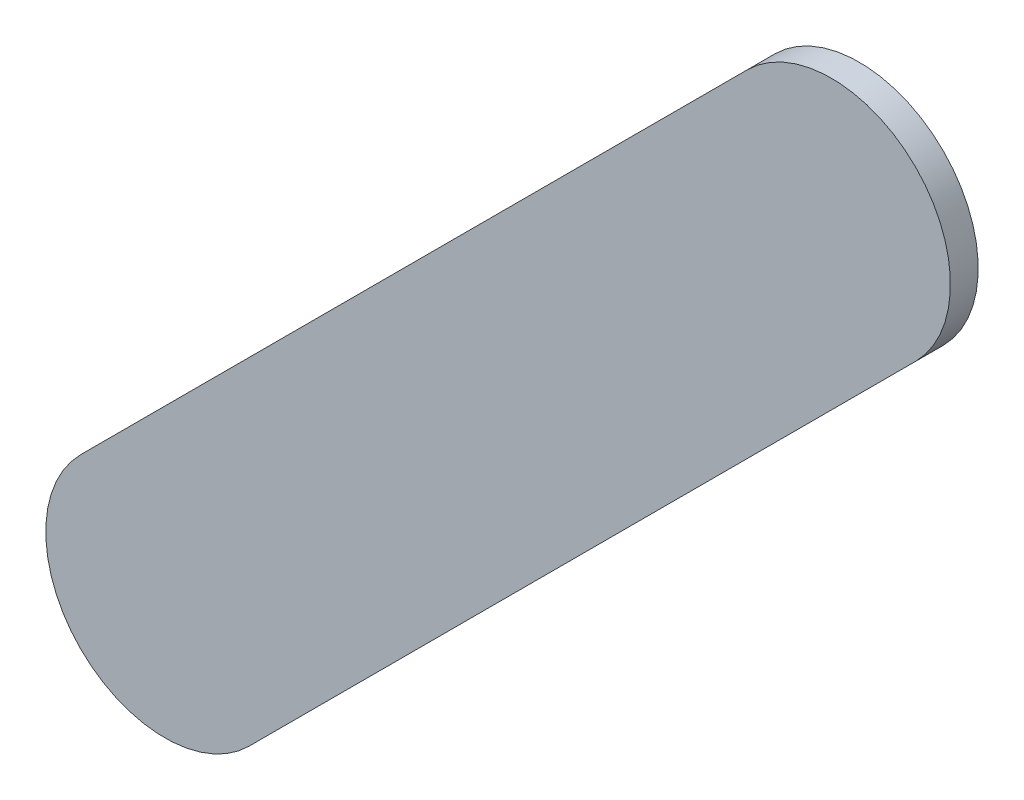
ISO-10303-21;
HEADER;
FILE_DESCRIPTION(('STEP AP214'),'2;1');
FILE_NAME('part.step','',(''),(''),'','','');
FILE_SCHEMA(('AUTOMOTIVE_DESIGN { 1 0 10303 214 1 1 1 1 }'));
ENDSEC;
DATA;
#1=APPLICATION_CONTEXT('core data for automotive mechanical design processes');
#2=APPLICATION_PROTOCOL_DEFINITION('international standard','automotive_design',2000,#1);
#3=PRODUCT_CONTEXT('',#1,'mechanical');
#4=PRODUCT('Part','Part','',(#3));
#5=PRODUCT_RELATED_PRODUCT_CATEGORY('part','',(#4));
#6=PRODUCT_DEFINITION_FORMATION('','',#4);
#7=PRODUCT_DEFINITION_CONTEXT('part definition',#1,'design');
#8=PRODUCT_DEFINITION('design','',#6,#7);
#9=PRODUCT_DEFINITION_SHAPE('','',#8);
#10=(LENGTH_UNIT() NAMED_UNIT(*) SI_UNIT(.MILLI.,.METRE.));
#11=(NAMED_UNIT(*) PLANE_ANGLE_UNIT() SI_UNIT($,.RADIAN.));
#12=(NAMED_UNIT(*) SI_UNIT($,.STERADIAN.) SOLID_ANGLE_UNIT());
#13=UNCERTAINTY_MEASURE_WITH_UNIT(LENGTH_MEASURE(1.E-05),#10,'distance_accuracy_value','');
#14=(GEOMETRIC_REPRESENTATION_CONTEXT(3) GLOBAL_UNCERTAINTY_ASSIGNED_CONTEXT((#13)) GLOBAL_UNIT_ASSIGNED_CONTEXT((#10,
#11,#12)) REPRESENTATION_CONTEXT('',''));
#15=CARTESIAN_POINT('',(0.,0.,0.));
#16=DIRECTION('',(0.,0.,1.));
#17=DIRECTION('',(1.,0.,0.));
#18=AXIS2_PLACEMENT_3D('',#15,#16,#17);
#19=CARTESIAN_POINT('',(130.106066,-60.896066,1.635));
#20=DIRECTION('',(0.,0.,1.));
#21=DIRECTION('',(1.,0.,0.));
#22=AXIS2_PLACEMENT_3D('',#19,#20,#21);
#23=PLANE('',#22);
#24=DIRECTION('',(0.707106781186548,0.707106781186548,0.));
#25=VECTOR('',#24,1.);
#26=CARTESIAN_POINT('',(130.106066,-60.896066,1.635));
#27=LINE('',#26,#25);
#28=CARTESIAN_POINT('',(130.106066,-60.896066,1.635));
#29=VERTEX_POINT('',#28);
#30=CARTESIAN_POINT('',(130.946066,-60.056066,1.635));
#31=VERTEX_POINT('',#30);
#32=EDGE_CURVE('E96',#29,#31,#27,.T.);
#33=ORIENTED_EDGE('',*,*,#32,.T.);
#34=CARTESIAN_POINT('',(130.8399995,-59.9499995,1.635));
#35=DIRECTION('',(0.,0.,1.));
#36=DIRECTION('',(0.707106781186548,-0.707106781186548,0.));
#37=AXIS2_PLACEMENT_3D('',#34,#35,#36);
#38=CIRCLE('',#37,0.150000682813);
#39=CARTESIAN_POINT('',(130.733933,-59.843933,1.635));
#40=VERTEX_POINT('',#39);
#41=EDGE_CURVE('E76',#31,#40,#38,.T.);
#42=ORIENTED_EDGE('',*,*,#41,.T.);
#43=DIRECTION('',(-0.707106781186548,-0.707106781186548,0.));
#44=VECTOR('',#43,1.);
#45=CARTESIAN_POINT('',(130.733933,-59.843933,1.635));
#46=LINE('',#45,#44);
#47=CARTESIAN_POINT('',(129.893933,-60.683933,1.635));
#48=VERTEX_POINT('',#47);
#49=EDGE_CURVE('E20',#40,#48,#46,.T.);
#50=ORIENTED_EDGE('',*,*,#49,.T.);
#51=CARTESIAN_POINT('',(129.9999995,-60.7899995,1.635));
#52=DIRECTION('',(0.,0.,1.));
#53=DIRECTION('',(-0.707106781186548,0.707106781186548,0.));
#54=AXIS2_PLACEMENT_3D('',#51,#52,#53);
#55=CIRCLE('',#54,0.150000682813);
#56=EDGE_CURVE('E11',#48,#29,#55,.T.);
#57=ORIENTED_EDGE('',*,*,#56,.T.);
#58=EDGE_LOOP('',(#33,#42,#50,#57));
#59=FACE_BOUND('',#58,.T.);
#60=ADVANCED_FACE('F17',(#59),#23,.T.);
#61=CARTESIAN_POINT('',(130.106066,-60.896066,1.6));
#62=DIRECTION('',(0.,0.,1.));
#63=DIRECTION('',(1.,0.,0.));
#64=AXIS2_PLACEMENT_3D('',#61,#62,#63);
#65=PLANE('',#64);
#66=CARTESIAN_POINT('',(129.9999995,-60.7899995,1.6));
#67=DIRECTION('',(0.,0.,1.));
#68=DIRECTION('',(-0.707106781186548,0.707106781186548,0.));
#69=AXIS2_PLACEMENT_3D('',#66,#67,#68);
#70=CIRCLE('',#69,0.150000682813);
#71=CARTESIAN_POINT('',(129.893933,-60.683933,1.6));
#72=VERTEX_POINT('',#71);
#73=CARTESIAN_POINT('',(130.106066,-60.896066,1.6));
#74=VERTEX_POINT('',#73);
#75=EDGE_CURVE('E27',#72,#74,#70,.T.);
#76=ORIENTED_EDGE('',*,*,#75,.F.);
#77=DIRECTION('',(-0.707106781186548,-0.707106781186548,0.));
#78=VECTOR('',#77,1.);
#79=CARTESIAN_POINT('',(130.733933,-59.843933,1.6));
#80=LINE('',#79,#78);
#81=CARTESIAN_POINT('',(130.733933,-59.843933,1.6));
#82=VERTEX_POINT('',#81);
#83=EDGE_CURVE('E64',#82,#72,#80,.T.);
#84=ORIENTED_EDGE('',*,*,#83,.F.);
#85=CARTESIAN_POINT('',(130.8399995,-59.9499995,1.6));
#86=DIRECTION('',(0.,0.,1.));
#87=DIRECTION('',(0.707106781186548,-0.707106781186548,0.));
#88=AXIS2_PLACEMENT_3D('',#85,#86,#87);
#89=CIRCLE('',#88,0.150000682813);
#90=CARTESIAN_POINT('',(130.946066,-60.056066,1.6));
#91=VERTEX_POINT('',#90);
#92=EDGE_CURVE('E69',#91,#82,#89,.T.);
#93=ORIENTED_EDGE('',*,*,#92,.F.);
#94=DIRECTION('',(0.707106781186548,0.707106781186548,0.));
#95=VECTOR('',#94,1.);
#96=CARTESIAN_POINT('',(130.106066,-60.896066,1.6));
#97=LINE('',#96,#95);
#98=EDGE_CURVE('E114',#74,#91,#97,.T.);
#99=ORIENTED_EDGE('',*,*,#98,.F.);
#100=EDGE_LOOP('',(#76,#84,#93,#99));
#101=FACE_BOUND('',#100,.T.);
#102=ADVANCED_FACE('F66',(#101),#65,.F.);
#103=CARTESIAN_POINT('',(129.9999995,-60.7899995,1.6));
#104=DIRECTION('',(0.,0.,-1.));
#105=DIRECTION('',(-0.707106781186548,0.707106781186548,0.));
#106=AXIS2_PLACEMENT_3D('',#103,#104,#105);
#107=CYLINDRICAL_SURFACE('',#106,0.150000682813);
#108=ORIENTED_EDGE('',*,*,#75,.T.);
#109=DIRECTION('',(0.,0.,1.));
#110=VECTOR('',#109,1.);
#111=CARTESIAN_POINT('',(130.106066,-60.896066,1.6));
#112=LINE('',#111,#110);
#113=EDGE_CURVE('E90',#74,#29,#112,.T.);
#114=ORIENTED_EDGE('',*,*,#113,.T.);
#115=ORIENTED_EDGE('',*,*,#56,.F.);
#116=DIRECTION('',(0.,0.,1.));
#117=VECTOR('',#116,1.);
#118=CARTESIAN_POINT('',(129.893933,-60.683933,1.6));
#119=LINE('',#118,#117);
#120=EDGE_CURVE('E75',#72,#48,#119,.T.);
#121=ORIENTED_EDGE('',*,*,#120,.F.);
#122=EDGE_LOOP('',(#108,#114,#115,#121));
#123=FACE_BOUND('',#122,.T.);
#124=ADVANCED_FACE('F163',(#123),#107,.T.);
#125=CARTESIAN_POINT('',(130.733933,-59.843933,1.6));
#126=DIRECTION('',(0.707106781186548,-0.707106781186548,0.));
#127=DIRECTION('',(0.,0.,-1.));
#128=AXIS2_PLACEMENT_3D('',#125,#126,#127);
#129=PLANE('',#128);
#130=ORIENTED_EDGE('',*,*,#83,.T.);
#131=ORIENTED_EDGE('',*,*,#120,.T.);
#132=ORIENTED_EDGE('',*,*,#49,.F.);
#133=DIRECTION('',(0.,0.,1.));
#134=VECTOR('',#133,1.);
#135=CARTESIAN_POINT('',(130.733933,-59.843933,1.6));
#136=LINE('',#135,#134);
#137=EDGE_CURVE('E79',#82,#40,#136,.T.);
#138=ORIENTED_EDGE('',*,*,#137,.F.);
#139=EDGE_LOOP('',(#130,#131,#132,#138));
#140=FACE_BOUND('',#139,.T.);
#141=ADVANCED_FACE('F80',(#140),#129,.F.);
#142=CARTESIAN_POINT('',(130.8399995,-59.9499995,1.6));
#143=DIRECTION('',(0.,0.,-1.));
#144=DIRECTION('',(0.707106781186548,-0.707106781186548,0.));
#145=AXIS2_PLACEMENT_3D('',#142,#143,#144);
#146=CYLINDRICAL_SURFACE('',#145,0.150000682813);
#147=ORIENTED_EDGE('',*,*,#92,.T.);
#148=ORIENTED_EDGE('',*,*,#137,.T.);
#149=ORIENTED_EDGE('',*,*,#41,.F.);
#150=DIRECTION('',(0.,0.,1.));
#151=VECTOR('',#150,1.);
#152=CARTESIAN_POINT('',(130.946066,-60.056066,1.6));
#153=LINE('',#152,#151);
#154=EDGE_CURVE('E87',#91,#31,#153,.T.);
#155=ORIENTED_EDGE('',*,*,#154,.F.);
#156=EDGE_LOOP('',(#147,#148,#149,#155));
#157=FACE_BOUND('',#156,.T.);
#158=ADVANCED_FACE('F85',(#157),#146,.T.);
#159=CARTESIAN_POINT('',(130.106066,-60.896066,1.6));
#160=DIRECTION('',(-0.707106781186548,0.707106781186548,0.));
#161=DIRECTION('',(0.,0.,1.));
#162=AXIS2_PLACEMENT_3D('',#159,#160,#161);
#163=PLANE('',#162);
#164=ORIENTED_EDGE('',*,*,#98,.T.);
#165=ORIENTED_EDGE('',*,*,#154,.T.);
#166=ORIENTED_EDGE('',*,*,#32,.F.);
#167=ORIENTED_EDGE('',*,*,#113,.F.);
#168=EDGE_LOOP('',(#164,#165,#166,#167));
#169=FACE_BOUND('',#168,.T.);
#170=ADVANCED_FACE('F123',(#169),#163,.F.);
#171=CLOSED_SHELL('',(#60,#102,#124,#141,#158,#170));
#172=MANIFOLD_SOLID_BREP('B1',#171);
#173=ADVANCED_BREP_SHAPE_REPRESENTATION('',(#18,#172),#14);
#174=SHAPE_DEFINITION_REPRESENTATION(#9,#173);
ENDSEC;
END-ISO-10303-21;
